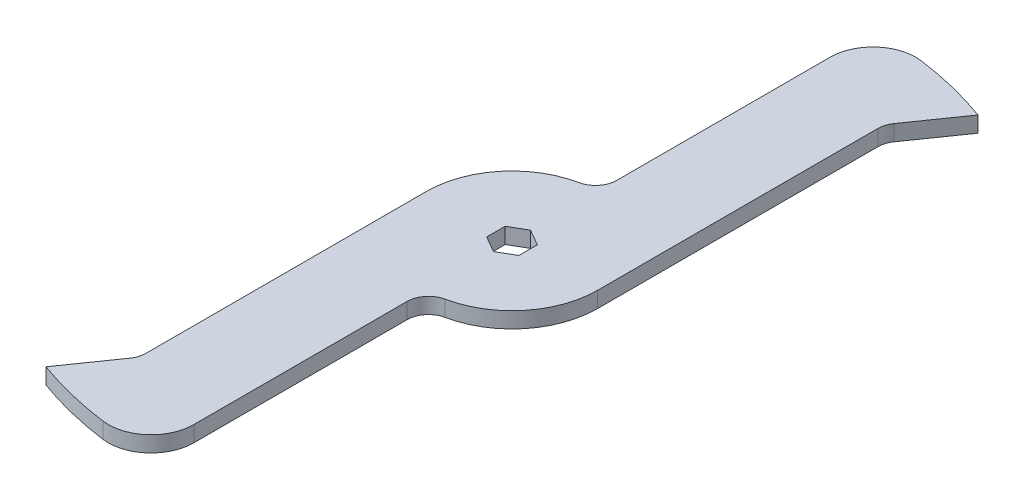
ISO-10303-21;
HEADER;
FILE_DESCRIPTION(('STEP AP214'),'2;1');
FILE_NAME('part.step','',(''),(''),'','','');
FILE_SCHEMA(('AUTOMOTIVE_DESIGN { 1 0 10303 214 1 1 1 1 }'));
ENDSEC;
DATA;
#1=APPLICATION_CONTEXT('core data for automotive mechanical design processes');
#2=APPLICATION_PROTOCOL_DEFINITION('international standard','automotive_design',2000,#1);
#3=PRODUCT_CONTEXT('',#1,'mechanical');
#4=PRODUCT('Part','Part','',(#3));
#5=PRODUCT_RELATED_PRODUCT_CATEGORY('part','',(#4));
#6=PRODUCT_DEFINITION_FORMATION('','',#4);
#7=PRODUCT_DEFINITION_CONTEXT('part definition',#1,'design');
#8=PRODUCT_DEFINITION('design','',#6,#7);
#9=PRODUCT_DEFINITION_SHAPE('','',#8);
#10=(LENGTH_UNIT() NAMED_UNIT(*) SI_UNIT(.MILLI.,.METRE.));
#11=(NAMED_UNIT(*) PLANE_ANGLE_UNIT() SI_UNIT($,.RADIAN.));
#12=(NAMED_UNIT(*) SI_UNIT($,.STERADIAN.) SOLID_ANGLE_UNIT());
#13=UNCERTAINTY_MEASURE_WITH_UNIT(LENGTH_MEASURE(1.E-05),#10,'distance_accuracy_value','');
#14=(GEOMETRIC_REPRESENTATION_CONTEXT(3) GLOBAL_UNCERTAINTY_ASSIGNED_CONTEXT((#13)) GLOBAL_UNIT_ASSIGNED_CONTEXT((#10,
#11,#12)) REPRESENTATION_CONTEXT('',''));
#15=CARTESIAN_POINT('',(0.,0.,0.));
#16=DIRECTION('',(0.,0.,1.));
#17=DIRECTION('',(1.,0.,0.));
#18=AXIS2_PLACEMENT_3D('',#15,#16,#17);
#19=CARTESIAN_POINT('',(2.53269627492614E-13,4.699,2.4980018054066E-13));
#20=DIRECTION('',(0.,-1.,0.));
#21=DIRECTION('',(0.,0.,-1.));
#22=AXIS2_PLACEMENT_3D('',#19,#20,#21);
#23=CYLINDRICAL_SURFACE('',#22,25.4000000000002);
#24=CARTESIAN_POINT('',(2.53269627492614E-13,4.699,2.4980018054066E-13));
#25=DIRECTION('',(0.,1.,0.));
#26=DIRECTION('',(0.,0.,1.));
#27=AXIS2_PLACEMENT_3D('',#24,#25,#26);
#28=CIRCLE('',#27,25.4000000000002);
#29=CARTESIAN_POINT('',(-5.07999999999996,4.699,-24.8868157866771));
#30=VERTEX_POINT('',#29);
#31=CARTESIAN_POINT('',(-25.4,4.699,0.));
#32=VERTEX_POINT('',#31);
#33=EDGE_CURVE('E237',#30,#32,#28,.T.);
#34=ORIENTED_EDGE('',*,*,#33,.F.);
#35=DIRECTION('',(0.,-1.,0.));
#36=VECTOR('',#35,1.);
#37=CARTESIAN_POINT('',(-5.07999999999996,4.699,-24.8868157866771));
#38=LINE('',#37,#36);
#39=CARTESIAN_POINT('',(-5.07999999999996,0.,-24.8868157866771));
#40=VERTEX_POINT('',#39);
#41=EDGE_CURVE('E310',#30,#40,#38,.T.);
#42=ORIENTED_EDGE('',*,*,#41,.T.);
#43=CARTESIAN_POINT('',(2.53269627492614E-13,0.,2.4980018054066E-13));
#44=DIRECTION('',(0.,1.,0.));
#45=DIRECTION('',(0.,0.,1.));
#46=AXIS2_PLACEMENT_3D('',#43,#44,#45);
#47=CIRCLE('',#46,25.4000000000002);
#48=CARTESIAN_POINT('',(-25.4,0.,0.));
#49=VERTEX_POINT('',#48);
#50=EDGE_CURVE('E202',#40,#49,#47,.T.);
#51=ORIENTED_EDGE('',*,*,#50,.T.);
#52=DIRECTION('',(0.,-1.,0.));
#53=VECTOR('',#52,1.);
#54=CARTESIAN_POINT('',(-25.4,4.699,0.));
#55=LINE('',#54,#53);
#56=EDGE_CURVE('E291',#32,#49,#55,.T.);
#57=ORIENTED_EDGE('',*,*,#56,.F.);
#58=EDGE_LOOP('',(#34,#42,#51,#57));
#59=FACE_BOUND('',#58,.T.);
#60=ADVANCED_FACE('F33',(#59),#23,.T.);
#61=CARTESIAN_POINT('',(-25.4,4.699,0.));
#62=DIRECTION('',(1.,0.,0.));
#63=DIRECTION('',(0.,0.,-1.));
#64=AXIS2_PLACEMENT_3D('',#61,#62,#63);
#65=PLANE('',#64);
#66=DIRECTION('',(0.,0.,1.));
#67=VECTOR('',#66,1.);
#68=CARTESIAN_POINT('',(-25.4,0.,0.));
#69=LINE('',#68,#67);
#70=CARTESIAN_POINT('',(-25.4,0.,83.1969812169564));
#71=VERTEX_POINT('',#70);
#72=EDGE_CURVE('E263',#49,#71,#69,.T.);
#73=ORIENTED_EDGE('',*,*,#72,.T.);
#74=DIRECTION('',(0.,-1.,0.));
#75=VECTOR('',#74,1.);
#76=CARTESIAN_POINT('',(-25.4,4.699,83.1969812169564));
#77=LINE('',#76,#75);
#78=CARTESIAN_POINT('',(-25.4,4.699,83.1969812169564));
#79=VERTEX_POINT('',#78);
#80=EDGE_CURVE('E297',#71,#79,#77,.F.);
#81=ORIENTED_EDGE('',*,*,#80,.T.);
#82=DIRECTION('',(0.,0.,1.));
#83=VECTOR('',#82,1.);
#84=CARTESIAN_POINT('',(-25.4,4.699,0.));
#85=LINE('',#84,#83);
#86=EDGE_CURVE('E239',#32,#79,#85,.T.);
#87=ORIENTED_EDGE('',*,*,#86,.F.);
#88=ORIENTED_EDGE('',*,*,#56,.T.);
#89=EDGE_LOOP('',(#73,#81,#87,#88));
#90=FACE_BOUND('',#89,.T.);
#91=ADVANCED_FACE('F402',(#90),#65,.F.);
#92=CARTESIAN_POINT('',(-25.4,4.699,85.194189942742));
#93=DIRECTION('',(0.819962905576217,0.,0.572416660728012));
#94=DIRECTION('',(0.572416660728012,0.,-0.819962905576217));
#95=AXIS2_PLACEMENT_3D('',#92,#93,#94);
#96=PLANE('',#95);
#97=DIRECTION('',(-0.572416660728012,0.,0.819962905576217));
#98=VECTOR('',#97,1.);
#99=CARTESIAN_POINT('',(-25.4,4.699,85.194189942742));
#100=LINE('',#99,#98);
#101=CARTESIAN_POINT('',(-26.543235549591,4.699,86.8318270125793));
#102=VERTEX_POINT('',#101);
#103=CARTESIAN_POINT('',(-36.7774876325107,4.699,101.491964723521));
#104=VERTEX_POINT('',#103);
#105=EDGE_CURVE('E243',#102,#104,#100,.T.);
#106=ORIENTED_EDGE('',*,*,#105,.F.);
#107=DIRECTION('',(0.,-1.,0.));
#108=VECTOR('',#107,1.);
#109=CARTESIAN_POINT('',(-26.543235549591,0.,86.8318270125793));
#110=LINE('',#109,#108);
#111=CARTESIAN_POINT('',(-26.543235549591,0.,86.8318270125793));
#112=VERTEX_POINT('',#111);
#113=EDGE_CURVE('E294',#102,#112,#110,.T.);
#114=ORIENTED_EDGE('',*,*,#113,.T.);
#115=DIRECTION('',(-0.572416660728012,0.,0.819962905576217));
#116=VECTOR('',#115,1.);
#117=CARTESIAN_POINT('',(-25.4,0.,85.194189942742));
#118=LINE('',#117,#116);
#119=CARTESIAN_POINT('',(-36.7774876325107,0.,101.491964723521));
#120=VERTEX_POINT('',#119);
#121=EDGE_CURVE('E266',#112,#120,#118,.T.);
#122=ORIENTED_EDGE('',*,*,#121,.T.);
#123=DIRECTION('',(0.,-1.,0.));
#124=VECTOR('',#123,1.);
#125=CARTESIAN_POINT('',(-36.7774876325107,4.699,101.491964723521));
#126=LINE('',#125,#124);
#127=EDGE_CURVE('E288',#104,#120,#126,.T.);
#128=ORIENTED_EDGE('',*,*,#127,.F.);
#129=EDGE_LOOP('',(#106,#114,#122,#128));
#130=FACE_BOUND('',#129,.T.);
#131=ADVANCED_FACE('F411',(#130),#96,.F.);
#132=CARTESIAN_POINT('',(0.,4.699,0.));
#133=DIRECTION('',(0.,-1.,0.));
#134=DIRECTION('',(0.,0.,-1.));
#135=AXIS2_PLACEMENT_3D('',#132,#133,#134);
#136=CYLINDRICAL_SURFACE('',#135,107.95);
#137=CARTESIAN_POINT('',(0.,0.,0.));
#138=DIRECTION('',(0.,1.,0.));
#139=DIRECTION('',(0.,0.,-1.));
#140=AXIS2_PLACEMENT_3D('',#137,#138,#139);
#141=CIRCLE('',#140,107.95);
#142=CARTESIAN_POINT('',(-14.3933333333333,0.,106.986141418202));
#143=VERTEX_POINT('',#142);
#144=EDGE_CURVE('E268',#120,#143,#141,.T.);
#145=ORIENTED_EDGE('',*,*,#144,.T.);
#146=DIRECTION('',(0.,-1.,0.));
#147=VECTOR('',#146,1.);
#148=CARTESIAN_POINT('',(-14.3933333333333,4.699,106.986141418202));
#149=LINE('',#148,#147);
#150=CARTESIAN_POINT('',(-14.3933333333333,4.699,106.986141418202));
#151=VERTEX_POINT('',#150);
#152=EDGE_CURVE('E11',#143,#151,#149,.F.);
#153=ORIENTED_EDGE('',*,*,#152,.T.);
#154=CARTESIAN_POINT('',(0.,4.699,0.));
#155=DIRECTION('',(0.,1.,0.));
#156=DIRECTION('',(0.,0.,-1.));
#157=AXIS2_PLACEMENT_3D('',#154,#155,#156);
#158=CIRCLE('',#157,107.95);
#159=EDGE_CURVE('E245',#104,#151,#158,.T.);
#160=ORIENTED_EDGE('',*,*,#159,.F.);
#161=ORIENTED_EDGE('',*,*,#127,.T.);
#162=EDGE_LOOP('',(#145,#153,#160,#161));
#163=FACE_BOUND('',#162,.T.);
#164=ADVANCED_FACE('F413',(#163),#136,.T.);
#165=CARTESIAN_POINT('',(0.,4.699,25.4));
#166=DIRECTION('',(-1.,0.,0.));
#167=DIRECTION('',(0.,0.,1.));
#168=AXIS2_PLACEMENT_3D('',#165,#166,#167);
#169=PLANE('',#168);
#170=DIRECTION('',(0.,0.,-1.));
#171=VECTOR('',#170,1.);
#172=CARTESIAN_POINT('',(0.,4.699,25.4));
#173=LINE('',#172,#171);
#174=CARTESIAN_POINT('',(0.,4.699,94.3995365454725));
#175=VERTEX_POINT('',#174);
#176=CARTESIAN_POINT('',(0.,4.699,31.1085197333463));
#177=VERTEX_POINT('',#176);
#178=EDGE_CURVE('E247',#175,#177,#173,.T.);
#179=ORIENTED_EDGE('',*,*,#178,.F.);
#180=DIRECTION('',(0.,-1.,0.));
#181=VECTOR('',#180,1.);
#182=CARTESIAN_POINT('',(0.,4.699,94.3995365454725));
#183=LINE('',#182,#181);
#184=CARTESIAN_POINT('',(0.,0.,94.3995365454725));
#185=VERTEX_POINT('',#184);
#186=EDGE_CURVE('E41',#175,#185,#183,.T.);
#187=ORIENTED_EDGE('',*,*,#186,.T.);
#188=DIRECTION('',(0.,0.,-1.));
#189=VECTOR('',#188,1.);
#190=CARTESIAN_POINT('',(0.,0.,25.4));
#191=LINE('',#190,#189);
#192=CARTESIAN_POINT('',(0.,0.,31.1085197333463));
#193=VERTEX_POINT('',#192);
#194=EDGE_CURVE('E270',#185,#193,#191,.T.);
#195=ORIENTED_EDGE('',*,*,#194,.T.);
#196=DIRECTION('',(0.,1.,0.));
#197=VECTOR('',#196,1.);
#198=CARTESIAN_POINT('',(0.,4.699,31.1085197333463));
#199=LINE('',#198,#197);
#200=EDGE_CURVE('E302',#193,#177,#199,.T.);
#201=ORIENTED_EDGE('',*,*,#200,.T.);
#202=EDGE_LOOP('',(#179,#187,#195,#201));
#203=FACE_BOUND('',#202,.T.);
#204=ADVANCED_FACE('F349',(#203),#169,.F.);
#205=CARTESIAN_POINT('',(0.,4.699,0.));
#206=DIRECTION('',(0.,-1.,0.));
#207=DIRECTION('',(0.,0.,-1.));
#208=AXIS2_PLACEMENT_3D('',#205,#206,#207);
#209=CYLINDRICAL_SURFACE('',#208,25.4);
#210=CARTESIAN_POINT('',(0.,4.699,0.));
#211=DIRECTION('',(0.,1.,0.));
#212=DIRECTION('',(0.,0.,-1.));
#213=AXIS2_PLACEMENT_3D('',#210,#211,#212);
#214=CIRCLE('',#213,25.4);
#215=CARTESIAN_POINT('',(5.07999999999999,4.699,24.8868157866771));
#216=VERTEX_POINT('',#215);
#217=CARTESIAN_POINT('',(25.4,4.699,0.));
#218=VERTEX_POINT('',#217);
#219=EDGE_CURVE('E249',#216,#218,#214,.T.);
#220=ORIENTED_EDGE('',*,*,#219,.F.);
#221=DIRECTION('',(0.,-1.,0.));
#222=VECTOR('',#221,1.);
#223=CARTESIAN_POINT('',(5.07999999999999,4.699,24.8868157866771));
#224=LINE('',#223,#222);
#225=CARTESIAN_POINT('',(5.07999999999999,0.,24.8868157866771));
#226=VERTEX_POINT('',#225);
#227=EDGE_CURVE('E299',#216,#226,#224,.T.);
#228=ORIENTED_EDGE('',*,*,#227,.T.);
#229=CARTESIAN_POINT('',(0.,0.,0.));
#230=DIRECTION('',(0.,1.,0.));
#231=DIRECTION('',(0.,0.,-1.));
#232=AXIS2_PLACEMENT_3D('',#229,#230,#231);
#233=CIRCLE('',#232,25.4);
#234=CARTESIAN_POINT('',(25.4,0.,0.));
#235=VERTEX_POINT('',#234);
#236=EDGE_CURVE('E272',#226,#235,#233,.T.);
#237=ORIENTED_EDGE('',*,*,#236,.T.);
#238=DIRECTION('',(0.,-1.,0.));
#239=VECTOR('',#238,1.);
#240=CARTESIAN_POINT('',(25.4,4.699,0.));
#241=LINE('',#240,#239);
#242=EDGE_CURVE('E285',#218,#235,#241,.T.);
#243=ORIENTED_EDGE('',*,*,#242,.F.);
#244=EDGE_LOOP('',(#220,#228,#237,#243));
#245=FACE_BOUND('',#244,.T.);
#246=ADVANCED_FACE('F364',(#245),#209,.T.);
#247=CARTESIAN_POINT('',(25.4,4.699,0.));
#248=DIRECTION('',(-1.,0.,0.));
#249=DIRECTION('',(0.,0.,1.));
#250=AXIS2_PLACEMENT_3D('',#247,#248,#249);
#251=PLANE('',#250);
#252=DIRECTION('',(0.,0.,-1.));
#253=VECTOR('',#252,1.);
#254=CARTESIAN_POINT('',(25.4,0.,0.));
#255=LINE('',#254,#253);
#256=CARTESIAN_POINT('',(25.4,0.,-83.1969812169564));
#257=VERTEX_POINT('',#256);
#258=EDGE_CURVE('E274',#235,#257,#255,.T.);
#259=ORIENTED_EDGE('',*,*,#258,.T.);
#260=DIRECTION('',(0.,-1.,0.));
#261=VECTOR('',#260,1.);
#262=CARTESIAN_POINT('',(25.4,4.699,-83.1969812169564));
#263=LINE('',#262,#261);
#264=CARTESIAN_POINT('',(25.4,4.699,-83.1969812169564));
#265=VERTEX_POINT('',#264);
#266=EDGE_CURVE('E308',#257,#265,#263,.F.);
#267=ORIENTED_EDGE('',*,*,#266,.T.);
#268=DIRECTION('',(0.,0.,-1.));
#269=VECTOR('',#268,1.);
#270=CARTESIAN_POINT('',(25.4,4.699,0.));
#271=LINE('',#270,#269);
#272=EDGE_CURVE('E251',#218,#265,#271,.T.);
#273=ORIENTED_EDGE('',*,*,#272,.F.);
#274=ORIENTED_EDGE('',*,*,#242,.T.);
#275=EDGE_LOOP('',(#259,#267,#273,#274));
#276=FACE_BOUND('',#275,.T.);
#277=ADVANCED_FACE('F367',(#276),#251,.F.);
#278=CARTESIAN_POINT('',(25.4,4.699,-85.194189942742));
#279=DIRECTION('',(-0.819962905576217,0.,-0.572416660728012));
#280=DIRECTION('',(-0.572416660728012,0.,0.819962905576217));
#281=AXIS2_PLACEMENT_3D('',#278,#279,#280);
#282=PLANE('',#281);
#283=DIRECTION('',(0.572416660728012,0.,-0.819962905576217));
#284=VECTOR('',#283,1.);
#285=CARTESIAN_POINT('',(25.4,4.699,-85.194189942742));
#286=LINE('',#285,#284);
#287=CARTESIAN_POINT('',(26.543235549591,4.699,-86.8318270125793));
#288=VERTEX_POINT('',#287);
#289=CARTESIAN_POINT('',(36.7774876325107,4.699,-101.491964723521));
#290=VERTEX_POINT('',#289);
#291=EDGE_CURVE('E254',#288,#290,#286,.T.);
#292=ORIENTED_EDGE('',*,*,#291,.F.);
#293=DIRECTION('',(0.,-1.,0.));
#294=VECTOR('',#293,1.);
#295=CARTESIAN_POINT('',(26.543235549591,0.,-86.8318270125793));
#296=LINE('',#295,#294);
#297=CARTESIAN_POINT('',(26.543235549591,0.,-86.8318270125793));
#298=VERTEX_POINT('',#297);
#299=EDGE_CURVE('E305',#288,#298,#296,.T.);
#300=ORIENTED_EDGE('',*,*,#299,.T.);
#301=DIRECTION('',(0.572416660728012,0.,-0.819962905576217));
#302=VECTOR('',#301,1.);
#303=CARTESIAN_POINT('',(25.4,0.,-85.194189942742));
#304=LINE('',#303,#302);
#305=CARTESIAN_POINT('',(36.7774876325107,0.,-101.491964723521));
#306=VERTEX_POINT('',#305);
#307=EDGE_CURVE('E277',#298,#306,#304,.T.);
#308=ORIENTED_EDGE('',*,*,#307,.T.);
#309=DIRECTION('',(0.,-1.,0.));
#310=VECTOR('',#309,1.);
#311=CARTESIAN_POINT('',(36.7774876325107,4.699,-101.491964723521));
#312=LINE('',#311,#310);
#313=EDGE_CURVE('E261',#290,#306,#312,.T.);
#314=ORIENTED_EDGE('',*,*,#313,.F.);
#315=EDGE_LOOP('',(#292,#300,#308,#314));
#316=FACE_BOUND('',#315,.T.);
#317=ADVANCED_FACE('F376',(#316),#282,.F.);
#318=CARTESIAN_POINT('',(0.,4.699,0.));
#319=DIRECTION('',(0.,-1.,0.));
#320=DIRECTION('',(0.,0.,-1.));
#321=AXIS2_PLACEMENT_3D('',#318,#319,#320);
#322=CYLINDRICAL_SURFACE('',#321,107.95);
#323=CARTESIAN_POINT('',(0.,0.,0.));
#324=DIRECTION('',(0.,1.,0.));
#325=DIRECTION('',(0.,0.,-1.));
#326=AXIS2_PLACEMENT_3D('',#323,#324,#325);
#327=CIRCLE('',#326,107.95);
#328=CARTESIAN_POINT('',(14.3933333333333,0.,-106.986141418202));
#329=VERTEX_POINT('',#328);
#330=EDGE_CURVE('E279',#306,#329,#327,.T.);
#331=ORIENTED_EDGE('',*,*,#330,.T.);
#332=DIRECTION('',(0.,-1.,0.));
#333=VECTOR('',#332,1.);
#334=CARTESIAN_POINT('',(14.3933333333333,4.699,-106.986141418202));
#335=LINE('',#334,#333);
#336=CARTESIAN_POINT('',(14.3933333333333,4.699,-106.986141418202));
#337=VERTEX_POINT('',#336);
#338=EDGE_CURVE('E341',#329,#337,#335,.F.);
#339=ORIENTED_EDGE('',*,*,#338,.T.);
#340=CARTESIAN_POINT('',(0.,4.699,0.));
#341=DIRECTION('',(0.,1.,0.));
#342=DIRECTION('',(0.,0.,-1.));
#343=AXIS2_PLACEMENT_3D('',#340,#341,#342);
#344=CIRCLE('',#343,107.95);
#345=EDGE_CURVE('E256',#290,#337,#344,.T.);
#346=ORIENTED_EDGE('',*,*,#345,.F.);
#347=ORIENTED_EDGE('',*,*,#313,.T.);
#348=EDGE_LOOP('',(#331,#339,#346,#347));
#349=FACE_BOUND('',#348,.T.);
#350=ADVANCED_FACE('F381',(#349),#322,.T.);
#351=CARTESIAN_POINT('',(0.,4.699,-25.4));
#352=DIRECTION('',(1.,0.,0.));
#353=DIRECTION('',(0.,0.,-1.));
#354=AXIS2_PLACEMENT_3D('',#351,#352,#353);
#355=PLANE('',#354);
#356=DIRECTION('',(0.,0.,1.));
#357=VECTOR('',#356,1.);
#358=CARTESIAN_POINT('',(0.,4.699,-25.4));
#359=LINE('',#358,#357);
#360=CARTESIAN_POINT('',(0.,4.699,-94.3995365454725));
#361=VERTEX_POINT('',#360);
#362=CARTESIAN_POINT('',(0.,4.699,-31.1085197333463));
#363=VERTEX_POINT('',#362);
#364=EDGE_CURVE('E259',#361,#363,#359,.T.);
#365=ORIENTED_EDGE('',*,*,#364,.F.);
#366=DIRECTION('',(0.,-1.,0.));
#367=VECTOR('',#366,1.);
#368=CARTESIAN_POINT('',(0.,4.699,-94.3995365454725));
#369=LINE('',#368,#367);
#370=CARTESIAN_POINT('',(0.,0.,-94.3995365454725));
#371=VERTEX_POINT('',#370);
#372=EDGE_CURVE('E334',#361,#371,#369,.T.);
#373=ORIENTED_EDGE('',*,*,#372,.T.);
#374=DIRECTION('',(0.,0.,1.));
#375=VECTOR('',#374,1.);
#376=CARTESIAN_POINT('',(0.,0.,-25.4));
#377=LINE('',#376,#375);
#378=CARTESIAN_POINT('',(0.,0.,-31.1085197333463));
#379=VERTEX_POINT('',#378);
#380=EDGE_CURVE('E240',#371,#379,#377,.T.);
#381=ORIENTED_EDGE('',*,*,#380,.T.);
#382=DIRECTION('',(0.,1.,0.));
#383=VECTOR('',#382,1.);
#384=CARTESIAN_POINT('',(0.,4.699,-31.1085197333463));
#385=LINE('',#384,#383);
#386=EDGE_CURVE('E313',#379,#363,#385,.T.);
#387=ORIENTED_EDGE('',*,*,#386,.T.);
#388=EDGE_LOOP('',(#365,#373,#381,#387));
#389=FACE_BOUND('',#388,.T.);
#390=ADVANCED_FACE('F389',(#389),#355,.F.);
#391=CARTESIAN_POINT('',(2.53269627492614E-13,4.699,2.4980018054066E-13));
#392=DIRECTION('',(0.,1.,0.));
#393=DIRECTION('',(0.,0.,1.));
#394=AXIS2_PLACEMENT_3D('',#391,#392,#393);
#395=PLANE('',#394);
#396=DIRECTION('',(-0.866025403784439,0.,-0.5));
#397=VECTOR('',#396,1.);
#398=CARTESIAN_POINT('',(4.76249999999999,4.699,-2.7496306570156));
#399=LINE('',#398,#397);
#400=CARTESIAN_POINT('',(4.76249999999999,4.699,-2.7496306570156));
#401=VERTEX_POINT('',#400);
#402=CARTESIAN_POINT('',(0.,4.699,-5.49926131403119));
#403=VERTEX_POINT('',#402);
#404=EDGE_CURVE('E189',#401,#403,#399,.T.);
#405=ORIENTED_EDGE('',*,*,#404,.F.);
#406=DIRECTION('',(0.,0.,-1.));
#407=VECTOR('',#406,1.);
#408=CARTESIAN_POINT('',(4.76249999999999,4.699,2.7496306570156));
#409=LINE('',#408,#407);
#410=CARTESIAN_POINT('',(4.76249999999999,4.699,2.7496306570156));
#411=VERTEX_POINT('',#410);
#412=EDGE_CURVE('E194',#411,#401,#409,.T.);
#413=ORIENTED_EDGE('',*,*,#412,.F.);
#414=DIRECTION('',(0.866025403784439,0.,-0.5));
#415=VECTOR('',#414,1.);
#416=CARTESIAN_POINT('',(0.,4.699,5.49926131403119));
#417=LINE('',#416,#415);
#418=CARTESIAN_POINT('',(0.,4.699,5.49926131403119));
#419=VERTEX_POINT('',#418);
#420=EDGE_CURVE('E224',#419,#411,#417,.T.);
#421=ORIENTED_EDGE('',*,*,#420,.F.);
#422=DIRECTION('',(0.866025403784439,0.,0.5));
#423=VECTOR('',#422,1.);
#424=CARTESIAN_POINT('',(-4.7625,4.699,2.74963065701559));
#425=LINE('',#424,#423);
#426=CARTESIAN_POINT('',(-4.7625,4.699,2.74963065701559));
#427=VERTEX_POINT('',#426);
#428=EDGE_CURVE('E221',#427,#419,#425,.T.);
#429=ORIENTED_EDGE('',*,*,#428,.F.);
#430=DIRECTION('',(0.,0.,1.));
#431=VECTOR('',#430,1.);
#432=CARTESIAN_POINT('',(-4.7625,4.699,-2.74963065701559));
#433=LINE('',#432,#431);
#434=CARTESIAN_POINT('',(-4.7625,4.699,-2.74963065701559));
#435=VERTEX_POINT('',#434);
#436=EDGE_CURVE('E218',#435,#427,#433,.T.);
#437=ORIENTED_EDGE('',*,*,#436,.F.);
#438=DIRECTION('',(-0.866025403784439,0.,0.5));
#439=VECTOR('',#438,1.);
#440=CARTESIAN_POINT('',(0.,4.699,-5.49926131403119));
#441=LINE('',#440,#439);
#442=EDGE_CURVE('E211',#403,#435,#441,.T.);
#443=ORIENTED_EDGE('',*,*,#442,.F.);
#444=EDGE_LOOP('',(#405,#413,#421,#429,#437,#443));
#445=FACE_BOUND('',#444,.T.);
#446=ORIENTED_EDGE('',*,*,#345,.T.);
#447=CARTESIAN_POINT('',(12.7,4.699,-94.3995365454725));
#448=DIRECTION('',(0.,1.,0.));
#449=DIRECTION('',(0.,0.,1.));
#450=AXIS2_PLACEMENT_3D('',#447,#448,#449);
#451=CIRCLE('',#450,12.7);
#452=EDGE_CURVE('E344',#337,#361,#451,.T.);
#453=ORIENTED_EDGE('',*,*,#452,.T.);
#454=ORIENTED_EDGE('',*,*,#364,.T.);
#455=CARTESIAN_POINT('',(-6.35,4.699,-31.1085197333463));
#456=DIRECTION('',(0.,1.,0.));
#457=DIRECTION('',(0.,0.,1.));
#458=AXIS2_PLACEMENT_3D('',#455,#456,#457);
#459=CIRCLE('',#458,6.35);
#460=EDGE_CURVE('E332',#363,#30,#459,.F.);
#461=ORIENTED_EDGE('',*,*,#460,.T.);
#462=ORIENTED_EDGE('',*,*,#33,.T.);
#463=ORIENTED_EDGE('',*,*,#86,.T.);
#464=CARTESIAN_POINT('',(-31.75,4.699,83.1969812169564));
#465=DIRECTION('',(0.,1.,0.));
#466=DIRECTION('',(0.,0.,1.));
#467=AXIS2_PLACEMENT_3D('',#464,#465,#466);
#468=CIRCLE('',#467,6.35);
#469=EDGE_CURVE('E318',#79,#102,#468,.F.);
#470=ORIENTED_EDGE('',*,*,#469,.T.);
#471=ORIENTED_EDGE('',*,*,#105,.T.);
#472=ORIENTED_EDGE('',*,*,#159,.T.);
#473=CARTESIAN_POINT('',(-12.7,4.699,94.3995365454725));
#474=DIRECTION('',(0.,1.,0.));
#475=DIRECTION('',(0.,0.,1.));
#476=AXIS2_PLACEMENT_3D('',#473,#474,#475);
#477=CIRCLE('',#476,12.7);
#478=EDGE_CURVE('E48',#151,#175,#477,.T.);
#479=ORIENTED_EDGE('',*,*,#478,.T.);
#480=ORIENTED_EDGE('',*,*,#178,.T.);
#481=CARTESIAN_POINT('',(6.35,4.699,31.1085197333463));
#482=DIRECTION('',(0.,1.,0.));
#483=DIRECTION('',(0.,0.,1.));
#484=AXIS2_PLACEMENT_3D('',#481,#482,#483);
#485=CIRCLE('',#484,6.35);
#486=EDGE_CURVE('E323',#177,#216,#485,.F.);
#487=ORIENTED_EDGE('',*,*,#486,.T.);
#488=ORIENTED_EDGE('',*,*,#219,.T.);
#489=ORIENTED_EDGE('',*,*,#272,.T.);
#490=CARTESIAN_POINT('',(31.75,4.699,-83.1969812169564));
#491=DIRECTION('',(0.,1.,0.));
#492=DIRECTION('',(0.,0.,1.));
#493=AXIS2_PLACEMENT_3D('',#490,#491,#492);
#494=CIRCLE('',#493,6.35);
#495=EDGE_CURVE('E327',#265,#288,#494,.F.);
#496=ORIENTED_EDGE('',*,*,#495,.T.);
#497=ORIENTED_EDGE('',*,*,#291,.T.);
#498=EDGE_LOOP('',(#446,#453,#454,#461,#462,#463,#470,#471,#472,#479,#480,#487,#488,#489,#496,#497));
#499=FACE_BOUND('',#498,.T.);
#500=ADVANCED_FACE('F361',(#445,#499),#395,.T.);
#501=CARTESIAN_POINT('',(2.53269627492614E-13,0.,2.4980018054066E-13));
#502=DIRECTION('',(0.,1.,0.));
#503=DIRECTION('',(0.,0.,1.));
#504=AXIS2_PLACEMENT_3D('',#501,#502,#503);
#505=PLANE('',#504);
#506=DIRECTION('',(0.,0.,1.));
#507=VECTOR('',#506,1.);
#508=CARTESIAN_POINT('',(4.76249999999999,0.,2.7496306570156));
#509=LINE('',#508,#507);
#510=CARTESIAN_POINT('',(4.76249999999999,0.,-2.7496306570156));
#511=VERTEX_POINT('',#510);
#512=CARTESIAN_POINT('',(4.76249999999999,0.,2.7496306570156));
#513=VERTEX_POINT('',#512);
#514=EDGE_CURVE('E209',#511,#513,#509,.T.);
#515=ORIENTED_EDGE('',*,*,#514,.F.);
#516=DIRECTION('',(0.866025403784439,0.,0.5));
#517=VECTOR('',#516,1.);
#518=CARTESIAN_POINT('',(4.76249999999999,0.,-2.7496306570156));
#519=LINE('',#518,#517);
#520=CARTESIAN_POINT('',(0.,0.,-5.49926131403119));
#521=VERTEX_POINT('',#520);
#522=EDGE_CURVE('E186',#521,#511,#519,.T.);
#523=ORIENTED_EDGE('',*,*,#522,.F.);
#524=DIRECTION('',(0.866025403784439,0.,-0.5));
#525=VECTOR('',#524,1.);
#526=CARTESIAN_POINT('',(0.,0.,-5.49926131403119));
#527=LINE('',#526,#525);
#528=CARTESIAN_POINT('',(-4.7625,0.,-2.74963065701559));
#529=VERTEX_POINT('',#528);
#530=EDGE_CURVE('E198',#529,#521,#527,.T.);
#531=ORIENTED_EDGE('',*,*,#530,.F.);
#532=DIRECTION('',(0.,0.,-1.));
#533=VECTOR('',#532,1.);
#534=CARTESIAN_POINT('',(-4.7625,0.,-2.74963065701559));
#535=LINE('',#534,#533);
#536=CARTESIAN_POINT('',(-4.7625,0.,2.74963065701559));
#537=VERTEX_POINT('',#536);
#538=EDGE_CURVE('E615',#537,#529,#535,.T.);
#539=ORIENTED_EDGE('',*,*,#538,.F.);
#540=DIRECTION('',(-0.866025403784439,0.,-0.5));
#541=VECTOR('',#540,1.);
#542=CARTESIAN_POINT('',(-4.7625,0.,2.74963065701559));
#543=LINE('',#542,#541);
#544=CARTESIAN_POINT('',(0.,0.,5.49926131403119));
#545=VERTEX_POINT('',#544);
#546=EDGE_CURVE('E614',#545,#537,#543,.T.);
#547=ORIENTED_EDGE('',*,*,#546,.F.);
#548=DIRECTION('',(-0.866025403784439,0.,0.5));
#549=VECTOR('',#548,1.);
#550=CARTESIAN_POINT('',(0.,0.,5.49926131403119));
#551=LINE('',#550,#549);
#552=EDGE_CURVE('E213',#513,#545,#551,.T.);
#553=ORIENTED_EDGE('',*,*,#552,.F.);
#554=EDGE_LOOP('',(#515,#523,#531,#539,#547,#553));
#555=FACE_BOUND('',#554,.T.);
#556=ORIENTED_EDGE('',*,*,#380,.F.);
#557=CARTESIAN_POINT('',(12.7,0.,-94.3995365454725));
#558=DIRECTION('',(0.,1.,0.));
#559=DIRECTION('',(0.,0.,1.));
#560=AXIS2_PLACEMENT_3D('',#557,#558,#559);
#561=CIRCLE('',#560,12.7);
#562=EDGE_CURVE('E339',#371,#329,#561,.F.);
#563=ORIENTED_EDGE('',*,*,#562,.T.);
#564=ORIENTED_EDGE('',*,*,#330,.F.);
#565=ORIENTED_EDGE('',*,*,#307,.F.);
#566=CARTESIAN_POINT('',(31.75,0.,-83.1969812169564));
#567=DIRECTION('',(0.,1.,0.));
#568=DIRECTION('',(0.,0.,1.));
#569=AXIS2_PLACEMENT_3D('',#566,#567,#568);
#570=CIRCLE('',#569,6.35);
#571=EDGE_CURVE('E325',#298,#257,#570,.T.);
#572=ORIENTED_EDGE('',*,*,#571,.T.);
#573=ORIENTED_EDGE('',*,*,#258,.F.);
#574=ORIENTED_EDGE('',*,*,#236,.F.);
#575=CARTESIAN_POINT('',(6.35,0.,31.1085197333463));
#576=DIRECTION('',(0.,1.,0.));
#577=DIRECTION('',(0.,0.,1.));
#578=AXIS2_PLACEMENT_3D('',#575,#576,#577);
#579=CIRCLE('',#578,6.35);
#580=EDGE_CURVE('E320',#226,#193,#579,.T.);
#581=ORIENTED_EDGE('',*,*,#580,.T.);
#582=ORIENTED_EDGE('',*,*,#194,.F.);
#583=CARTESIAN_POINT('',(-12.7,0.,94.3995365454725));
#584=DIRECTION('',(0.,1.,0.));
#585=DIRECTION('',(0.,0.,1.));
#586=AXIS2_PLACEMENT_3D('',#583,#584,#585);
#587=CIRCLE('',#586,12.7);
#588=EDGE_CURVE('E337',#185,#143,#587,.F.);
#589=ORIENTED_EDGE('',*,*,#588,.T.);
#590=ORIENTED_EDGE('',*,*,#144,.F.);
#591=ORIENTED_EDGE('',*,*,#121,.F.);
#592=CARTESIAN_POINT('',(-31.75,0.,83.1969812169564));
#593=DIRECTION('',(0.,1.,0.));
#594=DIRECTION('',(0.,0.,1.));
#595=AXIS2_PLACEMENT_3D('',#592,#593,#594);
#596=CIRCLE('',#595,6.35);
#597=EDGE_CURVE('E316',#112,#71,#596,.T.);
#598=ORIENTED_EDGE('',*,*,#597,.T.);
#599=ORIENTED_EDGE('',*,*,#72,.F.);
#600=ORIENTED_EDGE('',*,*,#50,.F.);
#601=CARTESIAN_POINT('',(-6.35,0.,-31.1085197333463));
#602=DIRECTION('',(0.,1.,0.));
#603=DIRECTION('',(0.,0.,1.));
#604=AXIS2_PLACEMENT_3D('',#601,#602,#603);
#605=CIRCLE('',#604,6.35);
#606=EDGE_CURVE('E329',#40,#379,#605,.T.);
#607=ORIENTED_EDGE('',*,*,#606,.T.);
#608=EDGE_LOOP('',(#556,#563,#564,#565,#572,#573,#574,#581,#582,#589,#590,#591,#598,#599,#600,#607));
#609=FACE_BOUND('',#608,.T.);
#610=ADVANCED_FACE('F205',(#555,#609),#505,.F.);
#611=CARTESIAN_POINT('',(4.76249999999999,-0.00100000000000013,-2.7496306570156));
#612=DIRECTION('',(0.5,0.,-0.866025403784439));
#613=DIRECTION('',(-0.866025403784439,0.,-0.5));
#614=AXIS2_PLACEMENT_3D('',#611,#612,#613);
#615=PLANE('',#614);
#616=ORIENTED_EDGE('',*,*,#522,.T.);
#617=DIRECTION('',(0.,1.,0.));
#618=VECTOR('',#617,1.);
#619=CARTESIAN_POINT('',(4.76249999999999,-0.00100000000000013,-2.7496306570156));
#620=LINE('',#619,#618);
#621=EDGE_CURVE('E203',#511,#401,#620,.T.);
#622=ORIENTED_EDGE('',*,*,#621,.T.);
#623=ORIENTED_EDGE('',*,*,#404,.T.);
#624=DIRECTION('',(0.,1.,0.));
#625=VECTOR('',#624,1.);
#626=CARTESIAN_POINT('',(0.,-0.00100000000000013,-5.49926131403119));
#627=LINE('',#626,#625);
#628=EDGE_CURVE('E182',#521,#403,#627,.T.);
#629=ORIENTED_EDGE('',*,*,#628,.F.);
#630=EDGE_LOOP('',(#616,#622,#623,#629));
#631=FACE_BOUND('',#630,.T.);
#632=ADVANCED_FACE('F184',(#631),#615,.F.);
#633=CARTESIAN_POINT('',(4.76249999999999,-0.00100000000000013,2.7496306570156));
#634=DIRECTION('',(1.,0.,0.));
#635=DIRECTION('',(0.,0.,-1.));
#636=AXIS2_PLACEMENT_3D('',#633,#634,#635);
#637=PLANE('',#636);
#638=ORIENTED_EDGE('',*,*,#514,.T.);
#639=DIRECTION('',(0.,1.,0.));
#640=VECTOR('',#639,1.);
#641=CARTESIAN_POINT('',(4.76249999999999,-0.00100000000000013,2.7496306570156));
#642=LINE('',#641,#640);
#643=EDGE_CURVE('E230',#513,#411,#642,.T.);
#644=ORIENTED_EDGE('',*,*,#643,.T.);
#645=ORIENTED_EDGE('',*,*,#412,.T.);
#646=ORIENTED_EDGE('',*,*,#621,.F.);
#647=EDGE_LOOP('',(#638,#644,#645,#646));
#648=FACE_BOUND('',#647,.T.);
#649=ADVANCED_FACE('F555',(#648),#637,.F.);
#650=CARTESIAN_POINT('',(0.,-0.00100000000000013,5.49926131403119));
#651=DIRECTION('',(0.5,0.,0.866025403784439));
#652=DIRECTION('',(0.866025403784439,0.,-0.5));
#653=AXIS2_PLACEMENT_3D('',#650,#651,#652);
#654=PLANE('',#653);
#655=ORIENTED_EDGE('',*,*,#552,.T.);
#656=DIRECTION('',(0.,1.,0.));
#657=VECTOR('',#656,1.);
#658=CARTESIAN_POINT('',(0.,-0.00100000000000013,5.49926131403119));
#659=LINE('',#658,#657);
#660=EDGE_CURVE('E232',#545,#419,#659,.T.);
#661=ORIENTED_EDGE('',*,*,#660,.T.);
#662=ORIENTED_EDGE('',*,*,#420,.T.);
#663=ORIENTED_EDGE('',*,*,#643,.F.);
#664=EDGE_LOOP('',(#655,#661,#662,#663));
#665=FACE_BOUND('',#664,.T.);
#666=ADVANCED_FACE('F545',(#665),#654,.F.);
#667=CARTESIAN_POINT('',(-4.7625,-0.00100000000000013,2.74963065701559));
#668=DIRECTION('',(-0.499999999999999,0.,0.866025403784439));
#669=DIRECTION('',(0.866025403784439,0.,0.5));
#670=AXIS2_PLACEMENT_3D('',#667,#668,#669);
#671=PLANE('',#670);
#672=ORIENTED_EDGE('',*,*,#546,.T.);
#673=DIRECTION('',(0.,1.,0.));
#674=VECTOR('',#673,1.);
#675=CARTESIAN_POINT('',(-4.7625,-0.00100000000000013,2.74963065701559));
#676=LINE('',#675,#674);
#677=EDGE_CURVE('E234',#537,#427,#676,.T.);
#678=ORIENTED_EDGE('',*,*,#677,.T.);
#679=ORIENTED_EDGE('',*,*,#428,.T.);
#680=ORIENTED_EDGE('',*,*,#660,.F.);
#681=EDGE_LOOP('',(#672,#678,#679,#680));
#682=FACE_BOUND('',#681,.T.);
#683=ADVANCED_FACE('F535',(#682),#671,.F.);
#684=CARTESIAN_POINT('',(-4.7625,-0.00100000000000013,-2.74963065701559));
#685=DIRECTION('',(-1.,0.,0.));
#686=DIRECTION('',(0.,0.,1.));
#687=AXIS2_PLACEMENT_3D('',#684,#685,#686);
#688=PLANE('',#687);
#689=ORIENTED_EDGE('',*,*,#538,.T.);
#690=DIRECTION('',(0.,1.,0.));
#691=VECTOR('',#690,1.);
#692=CARTESIAN_POINT('',(-4.7625,-0.00100000000000013,-2.74963065701559));
#693=LINE('',#692,#691);
#694=EDGE_CURVE('E193',#529,#435,#693,.T.);
#695=ORIENTED_EDGE('',*,*,#694,.T.);
#696=ORIENTED_EDGE('',*,*,#436,.T.);
#697=ORIENTED_EDGE('',*,*,#677,.F.);
#698=EDGE_LOOP('',(#689,#695,#696,#697));
#699=FACE_BOUND('',#698,.T.);
#700=ADVANCED_FACE('F525',(#699),#688,.F.);
#701=CARTESIAN_POINT('',(0.,-0.00100000000000013,-5.49926131403119));
#702=DIRECTION('',(-0.5,0.,-0.866025403784439));
#703=DIRECTION('',(-0.866025403784439,0.,0.5));
#704=AXIS2_PLACEMENT_3D('',#701,#702,#703);
#705=PLANE('',#704);
#706=ORIENTED_EDGE('',*,*,#530,.T.);
#707=ORIENTED_EDGE('',*,*,#628,.T.);
#708=ORIENTED_EDGE('',*,*,#442,.T.);
#709=ORIENTED_EDGE('',*,*,#694,.F.);
#710=EDGE_LOOP('',(#706,#707,#708,#709));
#711=FACE_BOUND('',#710,.T.);
#712=ADVANCED_FACE('F199',(#711),#705,.F.);
#713=CARTESIAN_POINT('',(-31.75,4.699,83.1969812169564));
#714=DIRECTION('',(0.,1.,0.));
#715=DIRECTION('',(0.,0.,1.));
#716=AXIS2_PLACEMENT_3D('',#713,#714,#715);
#717=CYLINDRICAL_SURFACE('',#716,6.35);
#718=ORIENTED_EDGE('',*,*,#469,.F.);
#719=ORIENTED_EDGE('',*,*,#80,.F.);
#720=ORIENTED_EDGE('',*,*,#597,.F.);
#721=ORIENTED_EDGE('',*,*,#113,.F.);
#722=EDGE_LOOP('',(#718,#719,#720,#721));
#723=FACE_BOUND('',#722,.T.);
#724=ADVANCED_FACE('F408',(#723),#717,.F.);
#725=CARTESIAN_POINT('',(6.35,4.699,31.1085197333463));
#726=DIRECTION('',(0.,-1.,0.));
#727=DIRECTION('',(0.,0.,-1.));
#728=AXIS2_PLACEMENT_3D('',#725,#726,#727);
#729=CYLINDRICAL_SURFACE('',#728,6.35);
#730=ORIENTED_EDGE('',*,*,#486,.F.);
#731=ORIENTED_EDGE('',*,*,#200,.F.);
#732=ORIENTED_EDGE('',*,*,#580,.F.);
#733=ORIENTED_EDGE('',*,*,#227,.F.);
#734=EDGE_LOOP('',(#730,#731,#732,#733));
#735=FACE_BOUND('',#734,.T.);
#736=ADVANCED_FACE('F359',(#735),#729,.F.);
#737=CARTESIAN_POINT('',(31.75,4.699,-83.1969812169564));
#738=DIRECTION('',(0.,1.,0.));
#739=DIRECTION('',(0.,0.,1.));
#740=AXIS2_PLACEMENT_3D('',#737,#738,#739);
#741=CYLINDRICAL_SURFACE('',#740,6.35);
#742=ORIENTED_EDGE('',*,*,#495,.F.);
#743=ORIENTED_EDGE('',*,*,#266,.F.);
#744=ORIENTED_EDGE('',*,*,#571,.F.);
#745=ORIENTED_EDGE('',*,*,#299,.F.);
#746=EDGE_LOOP('',(#742,#743,#744,#745));
#747=FACE_BOUND('',#746,.T.);
#748=ADVANCED_FACE('F373',(#747),#741,.F.);
#749=CARTESIAN_POINT('',(-6.35,4.699,-31.1085197333463));
#750=DIRECTION('',(0.,-1.,0.));
#751=DIRECTION('',(0.,0.,-1.));
#752=AXIS2_PLACEMENT_3D('',#749,#750,#751);
#753=CYLINDRICAL_SURFACE('',#752,6.35);
#754=ORIENTED_EDGE('',*,*,#460,.F.);
#755=ORIENTED_EDGE('',*,*,#386,.F.);
#756=ORIENTED_EDGE('',*,*,#606,.F.);
#757=ORIENTED_EDGE('',*,*,#41,.F.);
#758=EDGE_LOOP('',(#754,#755,#756,#757));
#759=FACE_BOUND('',#758,.T.);
#760=ADVANCED_FACE('F394',(#759),#753,.F.);
#761=CARTESIAN_POINT('',(12.7,4.699,-94.3995365454725));
#762=DIRECTION('',(0.,-1.,0.));
#763=DIRECTION('',(0.,0.,-1.));
#764=AXIS2_PLACEMENT_3D('',#761,#762,#763);
#765=CYLINDRICAL_SURFACE('',#764,12.7);
#766=ORIENTED_EDGE('',*,*,#452,.F.);
#767=ORIENTED_EDGE('',*,*,#338,.F.);
#768=ORIENTED_EDGE('',*,*,#562,.F.);
#769=ORIENTED_EDGE('',*,*,#372,.F.);
#770=EDGE_LOOP('',(#766,#767,#768,#769));
#771=FACE_BOUND('',#770,.T.);
#772=ADVANCED_FACE('F385',(#771),#765,.T.);
#773=CARTESIAN_POINT('',(-12.7,4.699,94.3995365454725));
#774=DIRECTION('',(0.,-1.,0.));
#775=DIRECTION('',(0.,0.,-1.));
#776=AXIS2_PLACEMENT_3D('',#773,#774,#775);
#777=CYLINDRICAL_SURFACE('',#776,12.7);
#778=ORIENTED_EDGE('',*,*,#478,.F.);
#779=ORIENTED_EDGE('',*,*,#152,.F.);
#780=ORIENTED_EDGE('',*,*,#588,.F.);
#781=ORIENTED_EDGE('',*,*,#186,.F.);
#782=EDGE_LOOP('',(#778,#779,#780,#781));
#783=FACE_BOUND('',#782,.T.);
#784=ADVANCED_FACE('F35',(#783),#777,.T.);
#785=CLOSED_SHELL('',(#60,#91,#131,#164,#204,#246,#277,#317,#350,#390,#500,#610,#632,#649,#666,
#683,#700,#712,#724,#736,#748,#760,#772,#784));
#786=MANIFOLD_SOLID_BREP('B2',#785);
#787=ADVANCED_BREP_SHAPE_REPRESENTATION('',(#18,#786),#14);
#788=SHAPE_DEFINITION_REPRESENTATION(#9,#787);
ENDSEC;
END-ISO-10303-21;
